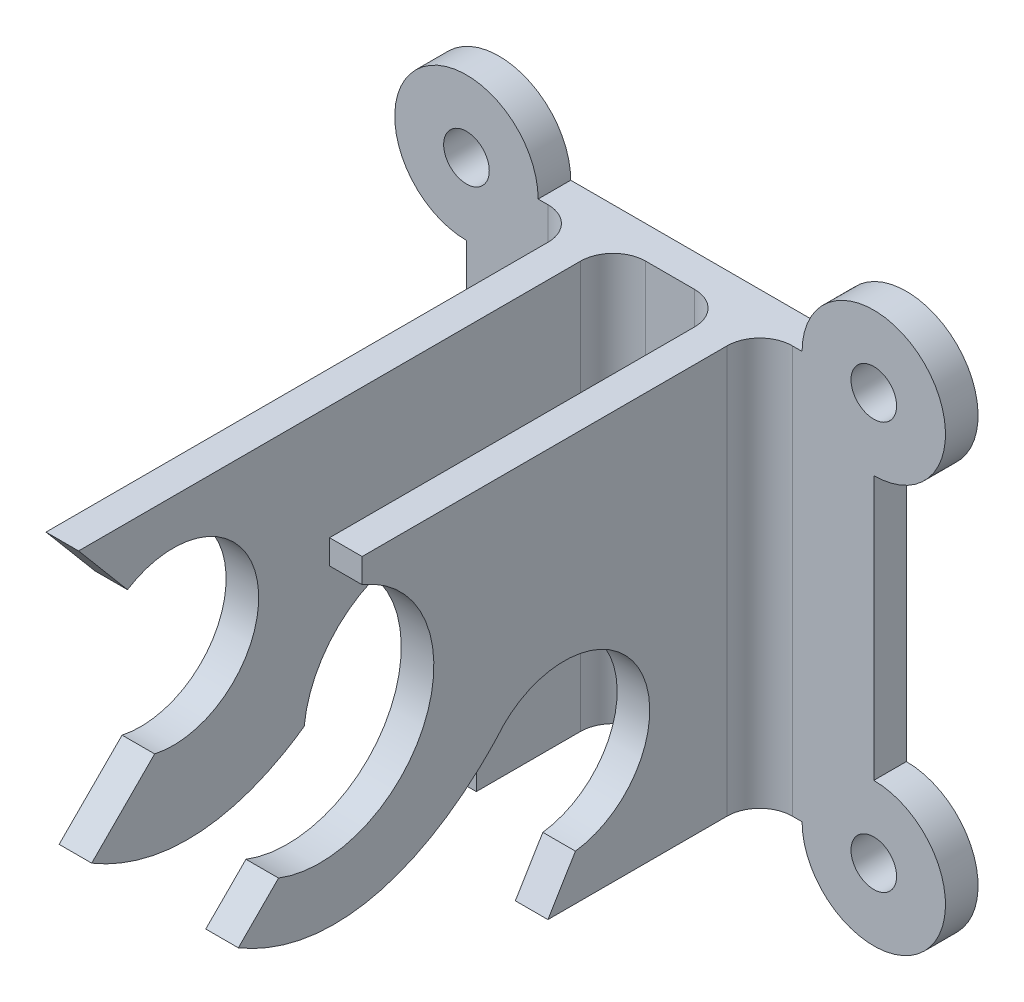
ISO-10303-21;
HEADER;
FILE_DESCRIPTION(('STEP AP214'),'2;1');
FILE_NAME('part.step','',(''),(''),'','','');
FILE_SCHEMA(('AUTOMOTIVE_DESIGN { 1 0 10303 214 1 1 1 1 }'));
ENDSEC;
DATA;
#1=APPLICATION_CONTEXT('core data for automotive mechanical design processes');
#2=APPLICATION_PROTOCOL_DEFINITION('international standard','automotive_design',2000,#1);
#3=PRODUCT_CONTEXT('',#1,'mechanical');
#4=PRODUCT('Part','Part','',(#3));
#5=PRODUCT_RELATED_PRODUCT_CATEGORY('part','',(#4));
#6=PRODUCT_DEFINITION_FORMATION('','',#4);
#7=PRODUCT_DEFINITION_CONTEXT('part definition',#1,'design');
#8=PRODUCT_DEFINITION('design','',#6,#7);
#9=PRODUCT_DEFINITION_SHAPE('','',#8);
#10=(LENGTH_UNIT() NAMED_UNIT(*) SI_UNIT(.MILLI.,.METRE.));
#11=(NAMED_UNIT(*) PLANE_ANGLE_UNIT() SI_UNIT($,.RADIAN.));
#12=(NAMED_UNIT(*) SI_UNIT($,.STERADIAN.) SOLID_ANGLE_UNIT());
#13=UNCERTAINTY_MEASURE_WITH_UNIT(LENGTH_MEASURE(1.E-05),#10,'distance_accuracy_value','');
#14=(GEOMETRIC_REPRESENTATION_CONTEXT(3) GLOBAL_UNCERTAINTY_ASSIGNED_CONTEXT((#13)) GLOBAL_UNIT_ASSIGNED_CONTEXT((#10,
#11,#12)) REPRESENTATION_CONTEXT('',''));
#15=CARTESIAN_POINT('',(0.,0.,0.));
#16=DIRECTION('',(0.,0.,1.));
#17=DIRECTION('',(1.,0.,0.));
#18=AXIS2_PLACEMENT_3D('',#15,#16,#17);
#19=CARTESIAN_POINT('',(0.,0.,2.));
#20=DIRECTION('',(0.,0.,-1.));
#21=DIRECTION('',(-1.,0.,0.));
#22=AXIS2_PLACEMENT_3D('',#19,#20,#21);
#23=CYLINDRICAL_SURFACE('',#22,4.4);
#24=CARTESIAN_POINT('',(0.,0.,0.));
#25=DIRECTION('',(0.,0.,1.));
#26=DIRECTION('',(1.,0.,0.));
#27=AXIS2_PLACEMENT_3D('',#24,#25,#26);
#28=CIRCLE('',#27,4.4);
#29=CARTESIAN_POINT('',(0.,4.4,0.));
#30=VERTEX_POINT('',#29);
#31=CARTESIAN_POINT('',(4.4,0.,0.));
#32=VERTEX_POINT('',#31);
#33=EDGE_CURVE('E353',#30,#32,#28,.T.);
#34=ORIENTED_EDGE('',*,*,#33,.T.);
#35=DIRECTION('',(0.,0.,-1.));
#36=VECTOR('',#35,1.);
#37=CARTESIAN_POINT('',(4.4,0.,2.));
#38=LINE('',#37,#36);
#39=CARTESIAN_POINT('',(4.4,0.,2.));
#40=VERTEX_POINT('',#39);
#41=EDGE_CURVE('E396',#40,#32,#38,.T.);
#42=ORIENTED_EDGE('',*,*,#41,.F.);
#43=CARTESIAN_POINT('',(0.,0.,2.));
#44=DIRECTION('',(0.,0.,1.));
#45=DIRECTION('',(1.,0.,0.));
#46=AXIS2_PLACEMENT_3D('',#43,#44,#45);
#47=CIRCLE('',#46,4.4);
#48=CARTESIAN_POINT('',(0.,4.4,2.));
#49=VERTEX_POINT('',#48);
#50=EDGE_CURVE('E354',#49,#40,#47,.T.);
#51=ORIENTED_EDGE('',*,*,#50,.F.);
#52=DIRECTION('',(0.,0.,-1.));
#53=VECTOR('',#52,1.);
#54=CARTESIAN_POINT('',(0.,4.4,2.));
#55=LINE('',#54,#53);
#56=EDGE_CURVE('E373',#49,#30,#55,.T.);
#57=ORIENTED_EDGE('',*,*,#56,.T.);
#58=EDGE_LOOP('',(#34,#42,#51,#57));
#59=FACE_BOUND('',#58,.T.);
#60=ADVANCED_FACE('F35',(#59),#23,.T.);
#61=CARTESIAN_POINT('',(0.,0.,2.));
#62=DIRECTION('',(0.,1.,0.));
#63=DIRECTION('',(0.,0.,1.));
#64=AXIS2_PLACEMENT_3D('',#61,#62,#63);
#65=PLANE('',#64);
#66=DIRECTION('',(0.,0.,-1.));
#67=VECTOR('',#66,1.);
#68=CARTESIAN_POINT('',(9.,0.,40.));
#69=LINE('',#68,#67);
#70=CARTESIAN_POINT('',(9.00000000000001,0.,10.394448724536));
#71=VERTEX_POINT('',#70);
#72=CARTESIAN_POINT('',(9.,0.,4.));
#73=VERTEX_POINT('',#72);
#74=EDGE_CURVE('E342',#71,#73,#69,.T.);
#75=ORIENTED_EDGE('',*,*,#74,.F.);
#76=DIRECTION('',(-1.,0.,0.));
#77=VECTOR('',#76,1.);
#78=CARTESIAN_POINT('',(29.401,0.,10.394448724536));
#79=LINE('',#78,#77);
#80=CARTESIAN_POINT('',(7.,0.,10.394448724536));
#81=VERTEX_POINT('',#80);
#82=EDGE_CURVE('E465',#71,#81,#79,.T.);
#83=ORIENTED_EDGE('',*,*,#82,.T.);
#84=DIRECTION('',(0.,0.,-1.));
#85=VECTOR('',#84,1.);
#86=CARTESIAN_POINT('',(7.,0.,40.));
#87=LINE('',#86,#85);
#88=CARTESIAN_POINT('',(7.,0.,4.));
#89=VERTEX_POINT('',#88);
#90=EDGE_CURVE('E345',#81,#89,#87,.T.);
#91=ORIENTED_EDGE('',*,*,#90,.T.);
#92=CARTESIAN_POINT('',(5.,0.,4.));
#93=DIRECTION('',(0.,1.,0.));
#94=DIRECTION('',(0.,0.,1.));
#95=AXIS2_PLACEMENT_3D('',#92,#93,#94);
#96=CIRCLE('',#95,2.);
#97=CARTESIAN_POINT('',(5.,0.,2.));
#98=VERTEX_POINT('',#97);
#99=EDGE_CURVE('E43',#89,#98,#96,.T.);
#100=ORIENTED_EDGE('',*,*,#99,.T.);
#101=DIRECTION('',(1.,0.,0.));
#102=VECTOR('',#101,1.);
#103=CARTESIAN_POINT('',(0.,0.,2.));
#104=LINE('',#103,#102);
#105=EDGE_CURVE('E357',#40,#98,#104,.T.);
#106=ORIENTED_EDGE('',*,*,#105,.F.);
#107=ORIENTED_EDGE('',*,*,#41,.T.);
#108=DIRECTION('',(1.,0.,0.));
#109=VECTOR('',#108,1.);
#110=CARTESIAN_POINT('',(0.,0.,0.));
#111=LINE('',#110,#109);
#112=CARTESIAN_POINT('',(20.6,0.,0.));
#113=VERTEX_POINT('',#112);
#114=EDGE_CURVE('E376',#32,#113,#111,.T.);
#115=ORIENTED_EDGE('',*,*,#114,.T.);
#116=DIRECTION('',(0.,0.,-1.));
#117=VECTOR('',#116,1.);
#118=CARTESIAN_POINT('',(20.6,0.,2.));
#119=LINE('',#118,#117);
#120=CARTESIAN_POINT('',(20.6,0.,2.));
#121=VERTEX_POINT('',#120);
#122=EDGE_CURVE('E303',#121,#113,#119,.T.);
#123=ORIENTED_EDGE('',*,*,#122,.F.);
#124=DIRECTION('',(1.,0.,0.));
#125=VECTOR('',#124,1.);
#126=CARTESIAN_POINT('',(0.,0.,2.));
#127=LINE('',#126,#125);
#128=CARTESIAN_POINT('',(20.,0.,2.));
#129=VERTEX_POINT('',#128);
#130=EDGE_CURVE('E295',#129,#121,#127,.T.);
#131=ORIENTED_EDGE('',*,*,#130,.F.);
#132=CARTESIAN_POINT('',(20.,0.,4.));
#133=DIRECTION('',(0.,1.,0.));
#134=DIRECTION('',(0.,0.,1.));
#135=AXIS2_PLACEMENT_3D('',#132,#133,#134);
#136=CIRCLE('',#135,2.);
#137=CARTESIAN_POINT('',(18.,0.,4.));
#138=VERTEX_POINT('',#137);
#139=EDGE_CURVE('E425',#129,#138,#136,.T.);
#140=ORIENTED_EDGE('',*,*,#139,.T.);
#141=DIRECTION('',(0.,0.,-1.));
#142=VECTOR('',#141,1.);
#143=CARTESIAN_POINT('',(18.,0.,40.));
#144=LINE('',#143,#142);
#145=CARTESIAN_POINT('',(18.,0.,15.));
#146=VERTEX_POINT('',#145);
#147=EDGE_CURVE('E328',#146,#138,#144,.T.);
#148=ORIENTED_EDGE('',*,*,#147,.F.);
#149=DIRECTION('',(-1.,0.,0.));
#150=VECTOR('',#149,1.);
#151=CARTESIAN_POINT('',(29.4,0.,15.));
#152=LINE('',#151,#150);
#153=CARTESIAN_POINT('',(16.,0.,15.));
#154=VERTEX_POINT('',#153);
#155=EDGE_CURVE('E614',#146,#154,#152,.T.);
#156=ORIENTED_EDGE('',*,*,#155,.T.);
#157=DIRECTION('',(0.,0.,-1.));
#158=VECTOR('',#157,1.);
#159=CARTESIAN_POINT('',(16.,0.,40.));
#160=LINE('',#159,#158);
#161=CARTESIAN_POINT('',(16.,0.,4.));
#162=VERTEX_POINT('',#161);
#163=EDGE_CURVE('E330',#154,#162,#160,.T.);
#164=ORIENTED_EDGE('',*,*,#163,.T.);
#165=CARTESIAN_POINT('',(14.,0.,4.));
#166=DIRECTION('',(0.,1.,0.));
#167=DIRECTION('',(0.,0.,1.));
#168=AXIS2_PLACEMENT_3D('',#165,#166,#167);
#169=CIRCLE('',#168,2.);
#170=CARTESIAN_POINT('',(14.,0.,2.));
#171=VERTEX_POINT('',#170);
#172=EDGE_CURVE('E429',#162,#171,#169,.T.);
#173=ORIENTED_EDGE('',*,*,#172,.T.);
#174=DIRECTION('',(1.,0.,0.));
#175=VECTOR('',#174,1.);
#176=CARTESIAN_POINT('',(0.,0.,2.));
#177=LINE('',#176,#175);
#178=CARTESIAN_POINT('',(11.,0.,2.));
#179=VERTEX_POINT('',#178);
#180=EDGE_CURVE('E336',#179,#171,#177,.T.);
#181=ORIENTED_EDGE('',*,*,#180,.F.);
#182=CARTESIAN_POINT('',(11.,0.,4.));
#183=DIRECTION('',(0.,1.,0.));
#184=DIRECTION('',(0.,0.,1.));
#185=AXIS2_PLACEMENT_3D('',#182,#183,#184);
#186=CIRCLE('',#185,2.);
#187=EDGE_CURVE('E433',#179,#73,#186,.T.);
#188=ORIENTED_EDGE('',*,*,#187,.T.);
#189=EDGE_LOOP('',(#75,#83,#91,#100,#106,#107,#115,#123,#131,#140,#148,#156,#164,#173,#181,#188));
#190=FACE_BOUND('',#189,.T.);
#191=ADVANCED_FACE('F452',(#190),#65,.F.);
#192=CARTESIAN_POINT('',(0.,25.,2.));
#193=DIRECTION('',(0.,1.,0.));
#194=DIRECTION('',(0.,0.,1.));
#195=AXIS2_PLACEMENT_3D('',#192,#193,#194);
#196=PLANE('',#195);
#197=DIRECTION('',(1.,0.,0.));
#198=VECTOR('',#197,1.);
#199=CARTESIAN_POINT('',(-4.40100000000001,25.,26.4019237886466));
#200=LINE('',#199,#198);
#201=CARTESIAN_POINT('',(16.,25.,26.4019237886466));
#202=VERTEX_POINT('',#201);
#203=CARTESIAN_POINT('',(18.,25.,26.4019237886466));
#204=VERTEX_POINT('',#203);
#205=EDGE_CURVE('E250',#202,#204,#200,.T.);
#206=ORIENTED_EDGE('',*,*,#205,.T.);
#207=DIRECTION('',(0.,0.,-1.));
#208=VECTOR('',#207,1.);
#209=CARTESIAN_POINT('',(18.,25.,40.));
#210=LINE('',#209,#208);
#211=CARTESIAN_POINT('',(18.,25.,4.));
#212=VERTEX_POINT('',#211);
#213=EDGE_CURVE('E249',#204,#212,#210,.T.);
#214=ORIENTED_EDGE('',*,*,#213,.T.);
#215=CARTESIAN_POINT('',(20.,25.,4.));
#216=DIRECTION('',(0.,1.,0.));
#217=DIRECTION('',(0.,0.,1.));
#218=AXIS2_PLACEMENT_3D('',#215,#216,#217);
#219=CIRCLE('',#218,2.);
#220=CARTESIAN_POINT('',(20.,25.,2.));
#221=VERTEX_POINT('',#220);
#222=EDGE_CURVE('E427',#212,#221,#219,.F.);
#223=ORIENTED_EDGE('',*,*,#222,.T.);
#224=DIRECTION('',(1.,0.,0.));
#225=VECTOR('',#224,1.);
#226=CARTESIAN_POINT('',(0.,25.,2.));
#227=LINE('',#226,#225);
#228=CARTESIAN_POINT('',(20.6,25.,2.));
#229=VERTEX_POINT('',#228);
#230=EDGE_CURVE('E293',#221,#229,#227,.T.);
#231=ORIENTED_EDGE('',*,*,#230,.T.);
#232=DIRECTION('',(0.,0.,-1.));
#233=VECTOR('',#232,1.);
#234=CARTESIAN_POINT('',(20.6,25.,2.));
#235=LINE('',#234,#233);
#236=CARTESIAN_POINT('',(20.6,25.,0.));
#237=VERTEX_POINT('',#236);
#238=EDGE_CURVE('E318',#229,#237,#235,.T.);
#239=ORIENTED_EDGE('',*,*,#238,.T.);
#240=DIRECTION('',(1.,0.,0.));
#241=VECTOR('',#240,1.);
#242=CARTESIAN_POINT('',(0.,25.,0.));
#243=LINE('',#242,#241);
#244=CARTESIAN_POINT('',(4.39999999999999,25.,0.));
#245=VERTEX_POINT('',#244);
#246=EDGE_CURVE('E378',#245,#237,#243,.T.);
#247=ORIENTED_EDGE('',*,*,#246,.F.);
#248=DIRECTION('',(0.,0.,-1.));
#249=VECTOR('',#248,1.);
#250=CARTESIAN_POINT('',(4.39999999999999,25.,2.));
#251=LINE('',#250,#249);
#252=CARTESIAN_POINT('',(4.39999999999999,25.,2.));
#253=VERTEX_POINT('',#252);
#254=EDGE_CURVE('E394',#253,#245,#251,.T.);
#255=ORIENTED_EDGE('',*,*,#254,.F.);
#256=DIRECTION('',(1.,0.,0.));
#257=VECTOR('',#256,1.);
#258=CARTESIAN_POINT('',(0.,25.,2.));
#259=LINE('',#258,#257);
#260=CARTESIAN_POINT('',(5.,25.,2.));
#261=VERTEX_POINT('',#260);
#262=EDGE_CURVE('E360',#253,#261,#259,.T.);
#263=ORIENTED_EDGE('',*,*,#262,.T.);
#264=CARTESIAN_POINT('',(5.,25.,4.));
#265=DIRECTION('',(0.,1.,0.));
#266=DIRECTION('',(0.,0.,1.));
#267=AXIS2_PLACEMENT_3D('',#264,#265,#266);
#268=CIRCLE('',#267,2.);
#269=CARTESIAN_POINT('',(7.,25.,4.));
#270=VERTEX_POINT('',#269);
#271=EDGE_CURVE('E11',#261,#270,#268,.F.);
#272=ORIENTED_EDGE('',*,*,#271,.T.);
#273=DIRECTION('',(0.,0.,-1.));
#274=VECTOR('',#273,1.);
#275=CARTESIAN_POINT('',(7.,25.,40.));
#276=LINE('',#275,#274);
#277=CARTESIAN_POINT('',(7.,25.,34.8048114115569));
#278=VERTEX_POINT('',#277);
#279=EDGE_CURVE('E347',#278,#270,#276,.T.);
#280=ORIENTED_EDGE('',*,*,#279,.F.);
#281=DIRECTION('',(-1.,0.,0.));
#282=VECTOR('',#281,1.);
#283=CARTESIAN_POINT('',(29.4,25.,34.8048114115569));
#284=LINE('',#283,#282);
#285=CARTESIAN_POINT('',(9.,25.,34.8048114115569));
#286=VERTEX_POINT('',#285);
#287=EDGE_CURVE('E612',#286,#278,#284,.T.);
#288=ORIENTED_EDGE('',*,*,#287,.F.);
#289=DIRECTION('',(0.,0.,-1.));
#290=VECTOR('',#289,1.);
#291=CARTESIAN_POINT('',(9.,25.,40.));
#292=LINE('',#291,#290);
#293=CARTESIAN_POINT('',(9.,25.,4.));
#294=VERTEX_POINT('',#293);
#295=EDGE_CURVE('E350',#286,#294,#292,.T.);
#296=ORIENTED_EDGE('',*,*,#295,.T.);
#297=CARTESIAN_POINT('',(11.,25.,4.));
#298=DIRECTION('',(0.,1.,0.));
#299=DIRECTION('',(0.,0.,1.));
#300=AXIS2_PLACEMENT_3D('',#297,#298,#299);
#301=CIRCLE('',#300,2.);
#302=CARTESIAN_POINT('',(11.,25.,2.));
#303=VERTEX_POINT('',#302);
#304=EDGE_CURVE('E435',#294,#303,#301,.F.);
#305=ORIENTED_EDGE('',*,*,#304,.T.);
#306=DIRECTION('',(1.,0.,0.));
#307=VECTOR('',#306,1.);
#308=CARTESIAN_POINT('',(0.,25.,2.));
#309=LINE('',#308,#307);
#310=CARTESIAN_POINT('',(14.,25.,2.));
#311=VERTEX_POINT('',#310);
#312=EDGE_CURVE('E339',#303,#311,#309,.T.);
#313=ORIENTED_EDGE('',*,*,#312,.T.);
#314=CARTESIAN_POINT('',(14.,25.,4.));
#315=DIRECTION('',(0.,1.,0.));
#316=DIRECTION('',(0.,0.,1.));
#317=AXIS2_PLACEMENT_3D('',#314,#315,#316);
#318=CIRCLE('',#317,2.);
#319=CARTESIAN_POINT('',(16.,25.,4.));
#320=VERTEX_POINT('',#319);
#321=EDGE_CURVE('E431',#311,#320,#318,.F.);
#322=ORIENTED_EDGE('',*,*,#321,.T.);
#323=DIRECTION('',(0.,0.,-1.));
#324=VECTOR('',#323,1.);
#325=CARTESIAN_POINT('',(16.,25.,40.));
#326=LINE('',#325,#324);
#327=EDGE_CURVE('E333',#202,#320,#326,.T.);
#328=ORIENTED_EDGE('',*,*,#327,.F.);
#329=EDGE_LOOP('',(#206,#214,#223,#231,#239,#247,#255,#263,#272,#280,#288,#296,#305,#313,#322,#328));
#330=FACE_BOUND('',#329,.T.);
#331=ADVANCED_FACE('F439',(#330),#196,.T.);
#332=CARTESIAN_POINT('',(0.,25.,2.));
#333=DIRECTION('',(0.,0.,-1.));
#334=DIRECTION('',(-1.,0.,0.));
#335=AXIS2_PLACEMENT_3D('',#332,#333,#334);
#336=CYLINDRICAL_SURFACE('',#335,4.4);
#337=CARTESIAN_POINT('',(0.,25.,0.));
#338=DIRECTION('',(0.,0.,1.));
#339=DIRECTION('',(1.,0.,0.));
#340=AXIS2_PLACEMENT_3D('',#337,#338,#339);
#341=CIRCLE('',#340,4.4);
#342=CARTESIAN_POINT('',(0.,20.6,0.));
#343=VERTEX_POINT('',#342);
#344=EDGE_CURVE('E380',#245,#343,#341,.T.);
#345=ORIENTED_EDGE('',*,*,#344,.T.);
#346=DIRECTION('',(0.,0.,-1.));
#347=VECTOR('',#346,1.);
#348=CARTESIAN_POINT('',(0.,20.6,2.));
#349=LINE('',#348,#347);
#350=CARTESIAN_POINT('',(0.,20.6,2.));
#351=VERTEX_POINT('',#350);
#352=EDGE_CURVE('E392',#351,#343,#349,.T.);
#353=ORIENTED_EDGE('',*,*,#352,.F.);
#354=CARTESIAN_POINT('',(0.,25.,2.));
#355=DIRECTION('',(0.,0.,1.));
#356=DIRECTION('',(1.,0.,0.));
#357=AXIS2_PLACEMENT_3D('',#354,#355,#356);
#358=CIRCLE('',#357,4.4);
#359=EDGE_CURVE('E362',#253,#351,#358,.T.);
#360=ORIENTED_EDGE('',*,*,#359,.F.);
#361=ORIENTED_EDGE('',*,*,#254,.T.);
#362=EDGE_LOOP('',(#345,#353,#360,#361));
#363=FACE_BOUND('',#362,.T.);
#364=ADVANCED_FACE('F562',(#363),#336,.T.);
#365=CARTESIAN_POINT('',(0.,0.,2.));
#366=DIRECTION('',(0.,0.,-1.));
#367=DIRECTION('',(-1.,0.,0.));
#368=AXIS2_PLACEMENT_3D('',#365,#366,#367);
#369=CYLINDRICAL_SURFACE('',#368,1.4);
#370=CARTESIAN_POINT('',(0.,0.,2.));
#371=DIRECTION('',(0.,0.,1.));
#372=DIRECTION('',(1.,0.,0.));
#373=AXIS2_PLACEMENT_3D('',#370,#371,#372);
#374=CIRCLE('',#373,1.4);
#375=CARTESIAN_POINT('',(1.4,0.,2.));
#376=VERTEX_POINT('',#375);
#377=EDGE_CURVE('E367',#376,#376,#374,.T.);
#378=ORIENTED_EDGE('',*,*,#377,.T.);
#379=EDGE_LOOP('',(#378));
#380=FACE_BOUND('',#379,.T.);
#381=CARTESIAN_POINT('',(0.,0.,0.));
#382=DIRECTION('',(0.,0.,1.));
#383=DIRECTION('',(1.,0.,0.));
#384=AXIS2_PLACEMENT_3D('',#381,#382,#383);
#385=CIRCLE('',#384,1.4);
#386=CARTESIAN_POINT('',(1.4,0.,0.));
#387=VERTEX_POINT('',#386);
#388=EDGE_CURVE('E386',#387,#387,#385,.T.);
#389=ORIENTED_EDGE('',*,*,#388,.F.);
#390=EDGE_LOOP('',(#389));
#391=FACE_BOUND('',#390,.T.);
#392=ADVANCED_FACE('F559',(#380,#391),#369,.F.);
#393=CARTESIAN_POINT('',(0.,0.,2.));
#394=DIRECTION('',(-1.,0.,0.));
#395=DIRECTION('',(0.,-1.,0.));
#396=AXIS2_PLACEMENT_3D('',#393,#394,#395);
#397=PLANE('',#396);
#398=DIRECTION('',(0.,1.,0.));
#399=VECTOR('',#398,1.);
#400=CARTESIAN_POINT('',(0.,0.,0.));
#401=LINE('',#400,#399);
#402=EDGE_CURVE('E383',#30,#343,#401,.T.);
#403=ORIENTED_EDGE('',*,*,#402,.F.);
#404=ORIENTED_EDGE('',*,*,#56,.F.);
#405=DIRECTION('',(0.,1.,0.));
#406=VECTOR('',#405,1.);
#407=CARTESIAN_POINT('',(0.,0.,2.));
#408=LINE('',#407,#406);
#409=EDGE_CURVE('E364',#49,#351,#408,.T.);
#410=ORIENTED_EDGE('',*,*,#409,.T.);
#411=ORIENTED_EDGE('',*,*,#352,.T.);
#412=EDGE_LOOP('',(#403,#404,#410,#411));
#413=FACE_BOUND('',#412,.T.);
#414=ADVANCED_FACE('F557',(#413),#397,.T.);
#415=CARTESIAN_POINT('',(0.,25.,2.));
#416=DIRECTION('',(0.,0.,-1.));
#417=DIRECTION('',(-1.,0.,0.));
#418=AXIS2_PLACEMENT_3D('',#415,#416,#417);
#419=CYLINDRICAL_SURFACE('',#418,1.4);
#420=CARTESIAN_POINT('',(0.,25.,2.));
#421=DIRECTION('',(0.,0.,1.));
#422=DIRECTION('',(1.,0.,0.));
#423=AXIS2_PLACEMENT_3D('',#420,#421,#422);
#424=CIRCLE('',#423,1.4);
#425=CARTESIAN_POINT('',(1.39999999999999,25.,2.));
#426=VERTEX_POINT('',#425);
#427=EDGE_CURVE('E370',#426,#426,#424,.T.);
#428=ORIENTED_EDGE('',*,*,#427,.T.);
#429=EDGE_LOOP('',(#428));
#430=FACE_BOUND('',#429,.T.);
#431=CARTESIAN_POINT('',(0.,25.,0.));
#432=DIRECTION('',(0.,0.,1.));
#433=DIRECTION('',(1.,0.,0.));
#434=AXIS2_PLACEMENT_3D('',#431,#432,#433);
#435=CIRCLE('',#434,1.4);
#436=CARTESIAN_POINT('',(1.39999999999999,25.,0.));
#437=VERTEX_POINT('',#436);
#438=EDGE_CURVE('E358',#437,#437,#435,.T.);
#439=ORIENTED_EDGE('',*,*,#438,.F.);
#440=EDGE_LOOP('',(#439));
#441=FACE_BOUND('',#440,.T.);
#442=ADVANCED_FACE('F551',(#430,#441),#419,.F.);
#443=CARTESIAN_POINT('',(0.,0.,2.));
#444=DIRECTION('',(0.,0.,1.));
#445=DIRECTION('',(1.,0.,0.));
#446=AXIS2_PLACEMENT_3D('',#443,#444,#445);
#447=PLANE('',#446);
#448=ORIENTED_EDGE('',*,*,#105,.T.);
#449=DIRECTION('',(0.,-1.,0.));
#450=VECTOR('',#449,1.);
#451=CARTESIAN_POINT('',(5.,0.,2.));
#452=LINE('',#451,#450);
#453=EDGE_CURVE('E50',#98,#261,#452,.F.);
#454=ORIENTED_EDGE('',*,*,#453,.T.);
#455=ORIENTED_EDGE('',*,*,#262,.F.);
#456=ORIENTED_EDGE('',*,*,#359,.T.);
#457=ORIENTED_EDGE('',*,*,#409,.F.);
#458=ORIENTED_EDGE('',*,*,#50,.T.);
#459=EDGE_LOOP('',(#448,#454,#455,#456,#457,#458));
#460=FACE_BOUND('',#459,.T.);
#461=ORIENTED_EDGE('',*,*,#377,.F.);
#462=EDGE_LOOP('',(#461));
#463=FACE_BOUND('',#462,.T.);
#464=ORIENTED_EDGE('',*,*,#427,.F.);
#465=EDGE_LOOP('',(#464));
#466=FACE_BOUND('',#465,.T.);
#467=ADVANCED_FACE('F548',(#460,#463,#466),#447,.T.);
#468=CARTESIAN_POINT('',(0.,0.,0.));
#469=DIRECTION('',(0.,0.,1.));
#470=DIRECTION('',(1.,0.,0.));
#471=AXIS2_PLACEMENT_3D('',#468,#469,#470);
#472=PLANE('',#471);
#473=ORIENTED_EDGE('',*,*,#33,.F.);
#474=ORIENTED_EDGE('',*,*,#402,.T.);
#475=ORIENTED_EDGE('',*,*,#344,.F.);
#476=ORIENTED_EDGE('',*,*,#246,.T.);
#477=CARTESIAN_POINT('',(25.,25.,0.));
#478=DIRECTION('',(0.,0.,1.));
#479=DIRECTION('',(1.,0.,0.));
#480=AXIS2_PLACEMENT_3D('',#477,#478,#479);
#481=CIRCLE('',#480,4.4);
#482=CARTESIAN_POINT('',(25.,20.6,0.));
#483=VERTEX_POINT('',#482);
#484=EDGE_CURVE('E308',#483,#237,#481,.T.);
#485=ORIENTED_EDGE('',*,*,#484,.F.);
#486=DIRECTION('',(0.,1.,0.));
#487=VECTOR('',#486,1.);
#488=CARTESIAN_POINT('',(25.,0.,0.));
#489=LINE('',#488,#487);
#490=CARTESIAN_POINT('',(25.,4.4,0.));
#491=VERTEX_POINT('',#490);
#492=EDGE_CURVE('E306',#491,#483,#489,.T.);
#493=ORIENTED_EDGE('',*,*,#492,.F.);
#494=CARTESIAN_POINT('',(25.,0.,0.));
#495=DIRECTION('',(0.,0.,1.));
#496=DIRECTION('',(1.,0.,0.));
#497=AXIS2_PLACEMENT_3D('',#494,#495,#496);
#498=CIRCLE('',#497,4.4);
#499=EDGE_CURVE('E283',#113,#491,#498,.T.);
#500=ORIENTED_EDGE('',*,*,#499,.F.);
#501=ORIENTED_EDGE('',*,*,#114,.F.);
#502=EDGE_LOOP('',(#473,#474,#475,#476,#485,#493,#500,#501));
#503=FACE_BOUND('',#502,.T.);
#504=ORIENTED_EDGE('',*,*,#388,.T.);
#505=EDGE_LOOP('',(#504));
#506=FACE_BOUND('',#505,.T.);
#507=ORIENTED_EDGE('',*,*,#438,.T.);
#508=EDGE_LOOP('',(#507));
#509=FACE_BOUND('',#508,.T.);
#510=CARTESIAN_POINT('',(25.,25.,0.));
#511=DIRECTION('',(0.,0.,1.));
#512=DIRECTION('',(1.,0.,0.));
#513=AXIS2_PLACEMENT_3D('',#510,#511,#512);
#514=CIRCLE('',#513,1.4);
#515=CARTESIAN_POINT('',(26.4,25.,0.));
#516=VERTEX_POINT('',#515);
#517=EDGE_CURVE('E311',#516,#516,#514,.T.);
#518=ORIENTED_EDGE('',*,*,#517,.T.);
#519=EDGE_LOOP('',(#518));
#520=FACE_BOUND('',#519,.T.);
#521=CARTESIAN_POINT('',(25.,0.,0.));
#522=DIRECTION('',(0.,0.,1.));
#523=DIRECTION('',(1.,0.,0.));
#524=AXIS2_PLACEMENT_3D('',#521,#522,#523);
#525=CIRCLE('',#524,1.4);
#526=CARTESIAN_POINT('',(26.4,0.,0.));
#527=VERTEX_POINT('',#526);
#528=EDGE_CURVE('E288',#527,#527,#525,.T.);
#529=ORIENTED_EDGE('',*,*,#528,.T.);
#530=EDGE_LOOP('',(#529));
#531=FACE_BOUND('',#530,.T.);
#532=ADVANCED_FACE('F544',(#503,#506,#509,#520,#531),#472,.F.);
#533=CARTESIAN_POINT('',(7.,0.,40.));
#534=DIRECTION('',(1.,0.,0.));
#535=DIRECTION('',(0.,1.,0.));
#536=AXIS2_PLACEMENT_3D('',#533,#534,#535);
#537=PLANE('',#536);
#538=ORIENTED_EDGE('',*,*,#279,.T.);
#539=DIRECTION('',(0.,-1.,0.));
#540=VECTOR('',#539,1.);
#541=CARTESIAN_POINT('',(7.,0.,4.));
#542=LINE('',#541,#540);
#543=EDGE_CURVE('E421',#270,#89,#542,.T.);
#544=ORIENTED_EDGE('',*,*,#543,.T.);
#545=ORIENTED_EDGE('',*,*,#90,.F.);
#546=DIRECTION('',(0.,-1.,0.));
#547=VECTOR('',#546,1.);
#548=CARTESIAN_POINT('',(7.,0.,10.394448724536));
#549=LINE('',#548,#547);
#550=CARTESIAN_POINT('',(7.,2.,10.394448724536));
#551=VERTEX_POINT('',#550);
#552=EDGE_CURVE('E462',#551,#81,#549,.T.);
#553=ORIENTED_EDGE('',*,*,#552,.F.);
#554=CARTESIAN_POINT('',(7.,8.,14.));
#555=DIRECTION('',(-1.,0.,0.));
#556=DIRECTION('',(0.,-1.,0.));
#557=AXIS2_PLACEMENT_3D('',#554,#555,#556);
#558=CIRCLE('',#557,7.);
#559=CARTESIAN_POINT('',(7.,8.74881908135148,20.9598326117374));
#560=VERTEX_POINT('',#559);
#561=EDGE_CURVE('E274',#560,#551,#558,.T.);
#562=ORIENTED_EDGE('',*,*,#561,.F.);
#563=CARTESIAN_POINT('',(7.,8.,34.));
#564=CARTESIAN_POINT('',(7.,4.56811171234291,28.1917284502045));
#565=CARTESIAN_POINT('',(7.,6.72069296549272,22.3497903186675));
#566=CARTESIAN_POINT('',(7.,11.2094298829705,18.154763510273));
#567=B_SPLINE_CURVE_WITH_KNOTS('',3,(#563,#564,#565,#566),.UNSPECIFIED.,.F.,.F.,(4,4),(0.,1.),.UNSPECIFIED.);
#568=CARTESIAN_POINT('',(7.,8.,34.));
#569=VERTEX_POINT('',#568);
#570=EDGE_CURVE('E602',#569,#560,#567,.T.);
#571=ORIENTED_EDGE('',*,*,#570,.F.);
#572=DIRECTION('',(0.,-0.708012201356827,0.706200200176877));
#573=VECTOR('',#572,1.);
#574=CARTESIAN_POINT('',(7.,11.8742938375118,30.1356215636516));
#575=LINE('',#574,#573);
#576=CARTESIAN_POINT('',(7.,11.8742938375118,30.1356215636516));
#577=VERTEX_POINT('',#576);
#578=EDGE_CURVE('E471',#577,#569,#575,.T.);
#579=ORIENTED_EDGE('',*,*,#578,.F.);
#580=CARTESIAN_POINT('',(7.,17.,29.));
#581=DIRECTION('',(-1.,0.,0.));
#582=DIRECTION('',(0.,-1.,0.));
#583=AXIS2_PLACEMENT_3D('',#580,#581,#582);
#584=CIRCLE('',#583,5.25);
#585=CARTESIAN_POINT('',(7.,21.4379649554272,31.8048114115569));
#586=VERTEX_POINT('',#585);
#587=EDGE_CURVE('E280',#586,#577,#584,.T.);
#588=ORIENTED_EDGE('',*,*,#587,.F.);
#589=DIRECTION('',(0.,-0.764869772211041,-0.644184935835844));
#590=VECTOR('',#589,1.);
#591=CARTESIAN_POINT('',(7.,21.4379649554273,31.8048114115569));
#592=LINE('',#591,#590);
#593=EDGE_CURVE('E597',#278,#586,#592,.T.);
#594=ORIENTED_EDGE('',*,*,#593,.F.);
#595=EDGE_LOOP('',(#538,#544,#545,#553,#562,#571,#579,#588,#594));
#596=FACE_BOUND('',#595,.T.);
#597=ADVANCED_FACE('F541',(#596),#537,.F.);
#598=CARTESIAN_POINT('',(9.00000000000001,0.,40.));
#599=DIRECTION('',(1.,0.,0.));
#600=DIRECTION('',(0.,1.,0.));
#601=AXIS2_PLACEMENT_3D('',#598,#599,#600);
#602=PLANE('',#601);
#603=ORIENTED_EDGE('',*,*,#74,.T.);
#604=DIRECTION('',(0.,-1.,0.));
#605=VECTOR('',#604,1.);
#606=CARTESIAN_POINT('',(9.,25.,4.));
#607=LINE('',#606,#605);
#608=EDGE_CURVE('E419',#73,#294,#607,.F.);
#609=ORIENTED_EDGE('',*,*,#608,.T.);
#610=ORIENTED_EDGE('',*,*,#295,.F.);
#611=DIRECTION('',(0.,0.764869772211041,0.644184935835844));
#612=VECTOR('',#611,1.);
#613=CARTESIAN_POINT('',(9.,12.934116564562,24.6427411754804));
#614=LINE('',#613,#612);
#615=CARTESIAN_POINT('',(9.,21.4379649554273,31.8048114115569));
#616=VERTEX_POINT('',#615);
#617=EDGE_CURVE('E625',#616,#286,#614,.T.);
#618=ORIENTED_EDGE('',*,*,#617,.F.);
#619=CARTESIAN_POINT('',(9.,17.,29.));
#620=DIRECTION('',(1.,0.,0.));
#621=DIRECTION('',(0.,1.,0.));
#622=AXIS2_PLACEMENT_3D('',#619,#620,#621);
#623=CIRCLE('',#622,5.25);
#624=CARTESIAN_POINT('',(9.,11.8742938375118,30.1356215636516));
#625=VERTEX_POINT('',#624);
#626=EDGE_CURVE('E277',#616,#625,#623,.F.);
#627=ORIENTED_EDGE('',*,*,#626,.T.);
#628=DIRECTION('',(0.,0.708012201356827,-0.706200200176877));
#629=VECTOR('',#628,1.);
#630=CARTESIAN_POINT('',(9.00000000000001,0.989759631883716,40.9922992029861));
#631=LINE('',#630,#629);
#632=CARTESIAN_POINT('',(9.00000000000001,8.,34.));
#633=VERTEX_POINT('',#632);
#634=EDGE_CURVE('E623',#633,#625,#631,.T.);
#635=ORIENTED_EDGE('',*,*,#634,.F.);
#636=CARTESIAN_POINT('',(9.00000000000001,8.,34.));
#637=CARTESIAN_POINT('',(9.00000000000001,4.56811171234291,28.1917284502045));
#638=CARTESIAN_POINT('',(9.00000000000001,6.72069296549273,22.3497903186675));
#639=CARTESIAN_POINT('',(9.00000000000001,11.2094298829705,18.154763510273));
#640=B_SPLINE_CURVE_WITH_KNOTS('',3,(#636,#637,#638,#639),.UNSPECIFIED.,.F.,.F.,(4,4),(0.,1.),.UNSPECIFIED.);
#641=CARTESIAN_POINT('',(9.00000000000001,8.74881908135148,20.9598326117374));
#642=VERTEX_POINT('',#641);
#643=EDGE_CURVE('E630',#642,#633,#640,.F.);
#644=ORIENTED_EDGE('',*,*,#643,.F.);
#645=CARTESIAN_POINT('',(9.00000000000001,8.,14.));
#646=DIRECTION('',(1.,0.,0.));
#647=DIRECTION('',(0.,1.,0.));
#648=AXIS2_PLACEMENT_3D('',#645,#646,#647);
#649=CIRCLE('',#648,7.);
#650=CARTESIAN_POINT('',(9.00000000000001,2.,10.394448724536));
#651=VERTEX_POINT('',#650);
#652=EDGE_CURVE('E271',#642,#651,#649,.F.);
#653=ORIENTED_EDGE('',*,*,#652,.T.);
#654=DIRECTION('',(0.,-1.,0.));
#655=VECTOR('',#654,1.);
#656=CARTESIAN_POINT('',(9.00000000000001,0.,10.394448724536));
#657=LINE('',#656,#655);
#658=EDGE_CURVE('E457',#651,#71,#657,.T.);
#659=ORIENTED_EDGE('',*,*,#658,.T.);
#660=EDGE_LOOP('',(#603,#609,#610,#618,#627,#635,#644,#653,#659));
#661=FACE_BOUND('',#660,.T.);
#662=ADVANCED_FACE('F456',(#661),#602,.T.);
#663=CARTESIAN_POINT('',(0.,0.,2.));
#664=DIRECTION('',(0.,0.,1.));
#665=DIRECTION('',(1.,0.,0.));
#666=AXIS2_PLACEMENT_3D('',#663,#664,#665);
#667=PLANE('',#666);
#668=ORIENTED_EDGE('',*,*,#180,.T.);
#669=DIRECTION('',(0.,-1.,0.));
#670=VECTOR('',#669,1.);
#671=CARTESIAN_POINT('',(14.,0.,2.));
#672=LINE('',#671,#670);
#673=EDGE_CURVE('E417',#171,#311,#672,.F.);
#674=ORIENTED_EDGE('',*,*,#673,.T.);
#675=ORIENTED_EDGE('',*,*,#312,.F.);
#676=DIRECTION('',(0.,-1.,0.));
#677=VECTOR('',#676,1.);
#678=CARTESIAN_POINT('',(11.,0.,2.));
#679=LINE('',#678,#677);
#680=EDGE_CURVE('E414',#303,#179,#679,.T.);
#681=ORIENTED_EDGE('',*,*,#680,.T.);
#682=EDGE_LOOP('',(#668,#674,#675,#681));
#683=FACE_BOUND('',#682,.T.);
#684=ADVANCED_FACE('F447',(#683),#667,.T.);
#685=CARTESIAN_POINT('',(16.,0.,40.));
#686=DIRECTION('',(1.,0.,0.));
#687=DIRECTION('',(0.,0.,-1.));
#688=AXIS2_PLACEMENT_3D('',#685,#686,#687);
#689=PLANE('',#688);
#690=ORIENTED_EDGE('',*,*,#327,.T.);
#691=DIRECTION('',(0.,-1.,0.));
#692=VECTOR('',#691,1.);
#693=CARTESIAN_POINT('',(16.,0.,4.));
#694=LINE('',#693,#692);
#695=EDGE_CURVE('E411',#320,#162,#694,.T.);
#696=ORIENTED_EDGE('',*,*,#695,.T.);
#697=ORIENTED_EDGE('',*,*,#163,.F.);
#698=DIRECTION('',(0.,0.856031490641379,-0.516923676213712));
#699=VECTOR('',#698,1.);
#700=CARTESIAN_POINT('',(16.,-11.0625736274261,21.6802521757575));
#701=LINE('',#700,#699);
#702=CARTESIAN_POINT('',(16.,2.79526939658851,13.3120469885873));
#703=VERTEX_POINT('',#702);
#704=EDGE_CURVE('E257',#154,#703,#701,.T.);
#705=ORIENTED_EDGE('',*,*,#704,.T.);
#706=CARTESIAN_POINT('',(16.,8.,14.));
#707=DIRECTION('',(1.,0.,0.));
#708=DIRECTION('',(0.,0.,-1.));
#709=AXIS2_PLACEMENT_3D('',#706,#707,#708);
#710=CIRCLE('',#709,5.25);
#711=CARTESIAN_POINT('',(16.,11.2094298829705,18.154763510273));
#712=VERTEX_POINT('',#711);
#713=EDGE_CURVE('E268',#712,#703,#710,.F.);
#714=ORIENTED_EDGE('',*,*,#713,.F.);
#715=CARTESIAN_POINT('',(16.,8.,34.));
#716=CARTESIAN_POINT('',(16.,4.56811171234291,28.1917284502045));
#717=CARTESIAN_POINT('',(16.,6.72069296549273,22.3497903186675));
#718=CARTESIAN_POINT('',(16.,11.2094298829705,18.154763510273));
#719=B_SPLINE_CURVE_WITH_KNOTS('',3,(#715,#716,#717,#718),.UNSPECIFIED.,.F.,.F.,(4,4),(0.,1.),.UNSPECIFIED.);
#720=CARTESIAN_POINT('',(16.,8.,34.));
#721=VERTEX_POINT('',#720);
#722=EDGE_CURVE('E641',#712,#721,#719,.F.);
#723=ORIENTED_EDGE('',*,*,#722,.T.);
#724=DIRECTION('',(0.,0.708012201356827,-0.706200200176877));
#725=VECTOR('',#724,1.);
#726=CARTESIAN_POINT('',(16.,0.989759631883716,40.9922992029861));
#727=LINE('',#726,#725);
#728=CARTESIAN_POINT('',(16.,10.4740762074138,31.5322556453403));
#729=VERTEX_POINT('',#728);
#730=EDGE_CURVE('E620',#721,#729,#727,.T.);
#731=ORIENTED_EDGE('',*,*,#730,.T.);
#732=CARTESIAN_POINT('',(16.,17.,29.));
#733=DIRECTION('',(1.,0.,0.));
#734=DIRECTION('',(0.,0.,-1.));
#735=AXIS2_PLACEMENT_3D('',#732,#733,#734);
#736=CIRCLE('',#735,7.00000000000001);
#737=CARTESIAN_POINT('',(16.,23.5,26.4019237886466));
#738=VERTEX_POINT('',#737);
#739=EDGE_CURVE('E256',#738,#729,#736,.F.);
#740=ORIENTED_EDGE('',*,*,#739,.F.);
#741=DIRECTION('',(0.,-1.,0.));
#742=VECTOR('',#741,1.);
#743=CARTESIAN_POINT('',(16.,25.,26.4019237886466));
#744=LINE('',#743,#742);
#745=EDGE_CURVE('E236',#202,#738,#744,.T.);
#746=ORIENTED_EDGE('',*,*,#745,.F.);
#747=EDGE_LOOP('',(#690,#696,#697,#705,#714,#723,#731,#740,#746));
#748=FACE_BOUND('',#747,.T.);
#749=ADVANCED_FACE('F535',(#748),#689,.F.);
#750=CARTESIAN_POINT('',(18.,0.,40.));
#751=DIRECTION('',(1.,0.,0.));
#752=DIRECTION('',(0.,1.,0.));
#753=AXIS2_PLACEMENT_3D('',#750,#751,#752);
#754=PLANE('',#753);
#755=ORIENTED_EDGE('',*,*,#147,.T.);
#756=DIRECTION('',(0.,-1.,0.));
#757=VECTOR('',#756,1.);
#758=CARTESIAN_POINT('',(18.,25.,4.));
#759=LINE('',#758,#757);
#760=EDGE_CURVE('E409',#138,#212,#759,.F.);
#761=ORIENTED_EDGE('',*,*,#760,.T.);
#762=ORIENTED_EDGE('',*,*,#213,.F.);
#763=DIRECTION('',(0.,1.,0.));
#764=VECTOR('',#763,1.);
#765=CARTESIAN_POINT('',(18.,25.,26.4019237886466));
#766=LINE('',#765,#764);
#767=CARTESIAN_POINT('',(18.,23.5,26.4019237886466));
#768=VERTEX_POINT('',#767);
#769=EDGE_CURVE('E233',#768,#204,#766,.T.);
#770=ORIENTED_EDGE('',*,*,#769,.F.);
#771=CARTESIAN_POINT('',(18.,17.,29.));
#772=DIRECTION('',(1.,0.,0.));
#773=DIRECTION('',(0.,1.,0.));
#774=AXIS2_PLACEMENT_3D('',#771,#772,#773);
#775=CIRCLE('',#774,7.00000000000001);
#776=CARTESIAN_POINT('',(18.,10.4740762074138,31.5322556453403));
#777=VERTEX_POINT('',#776);
#778=EDGE_CURVE('E247',#777,#768,#775,.T.);
#779=ORIENTED_EDGE('',*,*,#778,.F.);
#780=DIRECTION('',(0.,0.708012201356827,-0.706200200176877));
#781=VECTOR('',#780,1.);
#782=CARTESIAN_POINT('',(18.,0.989759631883717,40.9922992029861));
#783=LINE('',#782,#781);
#784=CARTESIAN_POINT('',(18.,8.,34.));
#785=VERTEX_POINT('',#784);
#786=EDGE_CURVE('E611',#785,#777,#783,.T.);
#787=ORIENTED_EDGE('',*,*,#786,.F.);
#788=CARTESIAN_POINT('',(18.,8.,34.));
#789=CARTESIAN_POINT('',(18.,4.56811171234291,28.1917284502045));
#790=CARTESIAN_POINT('',(18.,6.72069296549273,22.3497903186675));
#791=CARTESIAN_POINT('',(18.,11.2094298829705,18.154763510273));
#792=B_SPLINE_CURVE_WITH_KNOTS('',3,(#788,#789,#790,#791),.UNSPECIFIED.,.F.,.F.,(4,4),(0.,1.),.UNSPECIFIED.);
#793=CARTESIAN_POINT('',(18.,11.2094298829705,18.154763510273));
#794=VERTEX_POINT('',#793);
#795=EDGE_CURVE('E634',#794,#785,#792,.F.);
#796=ORIENTED_EDGE('',*,*,#795,.F.);
#797=CARTESIAN_POINT('',(18.,8.,14.));
#798=DIRECTION('',(1.,0.,0.));
#799=DIRECTION('',(0.,1.,0.));
#800=AXIS2_PLACEMENT_3D('',#797,#798,#799);
#801=CIRCLE('',#800,5.25);
#802=CARTESIAN_POINT('',(18.,2.79526939658851,13.3120469885873));
#803=VERTEX_POINT('',#802);
#804=EDGE_CURVE('E259',#803,#794,#801,.T.);
#805=ORIENTED_EDGE('',*,*,#804,.F.);
#806=DIRECTION('',(0.,0.856031490641379,-0.516923676213712));
#807=VECTOR('',#806,1.);
#808=CARTESIAN_POINT('',(18.,-11.0625736274261,21.6802521757575));
#809=LINE('',#808,#807);
#810=EDGE_CURVE('E262',#146,#803,#809,.T.);
#811=ORIENTED_EDGE('',*,*,#810,.F.);
#812=EDGE_LOOP('',(#755,#761,#762,#770,#779,#787,#796,#805,#811));
#813=FACE_BOUND('',#812,.T.);
#814=ADVANCED_FACE('F245',(#813),#754,.T.);
#815=CARTESIAN_POINT('',(25.,0.,2.));
#816=DIRECTION('',(0.,0.,-1.));
#817=DIRECTION('',(-1.,0.,0.));
#818=AXIS2_PLACEMENT_3D('',#815,#816,#817);
#819=CYLINDRICAL_SURFACE('',#818,4.4);
#820=ORIENTED_EDGE('',*,*,#499,.T.);
#821=DIRECTION('',(0.,0.,-1.));
#822=VECTOR('',#821,1.);
#823=CARTESIAN_POINT('',(25.,4.4,2.));
#824=LINE('',#823,#822);
#825=CARTESIAN_POINT('',(25.,4.4,2.));
#826=VERTEX_POINT('',#825);
#827=EDGE_CURVE('E324',#826,#491,#824,.T.);
#828=ORIENTED_EDGE('',*,*,#827,.F.);
#829=CARTESIAN_POINT('',(25.,0.,2.));
#830=DIRECTION('',(0.,0.,1.));
#831=DIRECTION('',(1.,0.,0.));
#832=AXIS2_PLACEMENT_3D('',#829,#830,#831);
#833=CIRCLE('',#832,4.4);
#834=EDGE_CURVE('E284',#121,#826,#833,.T.);
#835=ORIENTED_EDGE('',*,*,#834,.F.);
#836=ORIENTED_EDGE('',*,*,#122,.T.);
#837=EDGE_LOOP('',(#820,#828,#835,#836));
#838=FACE_BOUND('',#837,.T.);
#839=ADVANCED_FACE('F528',(#838),#819,.T.);
#840=CARTESIAN_POINT('',(25.,0.,2.));
#841=DIRECTION('',(-1.,0.,0.));
#842=DIRECTION('',(0.,-1.,0.));
#843=AXIS2_PLACEMENT_3D('',#840,#841,#842);
#844=PLANE('',#843);
#845=ORIENTED_EDGE('',*,*,#492,.T.);
#846=DIRECTION('',(0.,0.,-1.));
#847=VECTOR('',#846,1.);
#848=CARTESIAN_POINT('',(25.,20.6,2.));
#849=LINE('',#848,#847);
#850=CARTESIAN_POINT('',(25.,20.6,2.));
#851=VERTEX_POINT('',#850);
#852=EDGE_CURVE('E321',#851,#483,#849,.T.);
#853=ORIENTED_EDGE('',*,*,#852,.F.);
#854=DIRECTION('',(0.,1.,0.));
#855=VECTOR('',#854,1.);
#856=CARTESIAN_POINT('',(25.,0.,2.));
#857=LINE('',#856,#855);
#858=EDGE_CURVE('E287',#826,#851,#857,.T.);
#859=ORIENTED_EDGE('',*,*,#858,.F.);
#860=ORIENTED_EDGE('',*,*,#827,.T.);
#861=EDGE_LOOP('',(#845,#853,#859,#860));
#862=FACE_BOUND('',#861,.T.);
#863=ADVANCED_FACE('F524',(#862),#844,.F.);
#864=CARTESIAN_POINT('',(25.,25.,2.));
#865=DIRECTION('',(0.,0.,-1.));
#866=DIRECTION('',(-1.,0.,0.));
#867=AXIS2_PLACEMENT_3D('',#864,#865,#866);
#868=CYLINDRICAL_SURFACE('',#867,4.4);
#869=ORIENTED_EDGE('',*,*,#484,.T.);
#870=ORIENTED_EDGE('',*,*,#238,.F.);
#871=CARTESIAN_POINT('',(25.,25.,2.));
#872=DIRECTION('',(0.,0.,1.));
#873=DIRECTION('',(1.,0.,0.));
#874=AXIS2_PLACEMENT_3D('',#871,#872,#873);
#875=CIRCLE('',#874,4.4);
#876=EDGE_CURVE('E290',#851,#229,#875,.T.);
#877=ORIENTED_EDGE('',*,*,#876,.F.);
#878=ORIENTED_EDGE('',*,*,#852,.T.);
#879=EDGE_LOOP('',(#869,#870,#877,#878));
#880=FACE_BOUND('',#879,.T.);
#881=ADVANCED_FACE('F520',(#880),#868,.T.);
#882=CARTESIAN_POINT('',(25.,25.,2.));
#883=DIRECTION('',(0.,0.,-1.));
#884=DIRECTION('',(-1.,0.,0.));
#885=AXIS2_PLACEMENT_3D('',#882,#883,#884);
#886=CYLINDRICAL_SURFACE('',#885,1.4);
#887=CARTESIAN_POINT('',(25.,25.,2.));
#888=DIRECTION('',(0.,0.,1.));
#889=DIRECTION('',(1.,0.,0.));
#890=AXIS2_PLACEMENT_3D('',#887,#888,#889);
#891=CIRCLE('',#890,1.4);
#892=CARTESIAN_POINT('',(26.4,25.,2.));
#893=VERTEX_POINT('',#892);
#894=EDGE_CURVE('E297',#893,#893,#891,.T.);
#895=ORIENTED_EDGE('',*,*,#894,.T.);
#896=EDGE_LOOP('',(#895));
#897=FACE_BOUND('',#896,.T.);
#898=ORIENTED_EDGE('',*,*,#517,.F.);
#899=EDGE_LOOP('',(#898));
#900=FACE_BOUND('',#899,.T.);
#901=ADVANCED_FACE('F516',(#897,#900),#886,.F.);
#902=CARTESIAN_POINT('',(25.,0.,2.));
#903=DIRECTION('',(0.,0.,-1.));
#904=DIRECTION('',(-1.,0.,0.));
#905=AXIS2_PLACEMENT_3D('',#902,#903,#904);
#906=CYLINDRICAL_SURFACE('',#905,1.4);
#907=CARTESIAN_POINT('',(25.,0.,2.));
#908=DIRECTION('',(0.,0.,1.));
#909=DIRECTION('',(1.,0.,0.));
#910=AXIS2_PLACEMENT_3D('',#907,#908,#909);
#911=CIRCLE('',#910,1.4);
#912=CARTESIAN_POINT('',(26.4,0.,2.));
#913=VERTEX_POINT('',#912);
#914=EDGE_CURVE('E300',#913,#913,#911,.T.);
#915=ORIENTED_EDGE('',*,*,#914,.T.);
#916=EDGE_LOOP('',(#915));
#917=FACE_BOUND('',#916,.T.);
#918=ORIENTED_EDGE('',*,*,#528,.F.);
#919=EDGE_LOOP('',(#918));
#920=FACE_BOUND('',#919,.T.);
#921=ADVANCED_FACE('F512',(#917,#920),#906,.F.);
#922=CARTESIAN_POINT('',(0.,0.,2.));
#923=DIRECTION('',(0.,0.,1.));
#924=DIRECTION('',(1.,0.,0.));
#925=AXIS2_PLACEMENT_3D('',#922,#923,#924);
#926=PLANE('',#925);
#927=ORIENTED_EDGE('',*,*,#230,.F.);
#928=DIRECTION('',(0.,-1.,0.));
#929=VECTOR('',#928,1.);
#930=CARTESIAN_POINT('',(20.,0.,2.));
#931=LINE('',#930,#929);
#932=EDGE_CURVE('E406',#221,#129,#931,.T.);
#933=ORIENTED_EDGE('',*,*,#932,.T.);
#934=ORIENTED_EDGE('',*,*,#130,.T.);
#935=ORIENTED_EDGE('',*,*,#834,.T.);
#936=ORIENTED_EDGE('',*,*,#858,.T.);
#937=ORIENTED_EDGE('',*,*,#876,.T.);
#938=EDGE_LOOP('',(#927,#933,#934,#935,#936,#937));
#939=FACE_BOUND('',#938,.T.);
#940=ORIENTED_EDGE('',*,*,#894,.F.);
#941=EDGE_LOOP('',(#940));
#942=FACE_BOUND('',#941,.T.);
#943=ORIENTED_EDGE('',*,*,#914,.F.);
#944=EDGE_LOOP('',(#943));
#945=FACE_BOUND('',#944,.T.);
#946=ADVANCED_FACE('F508',(#939,#942,#945),#926,.T.);
#947=CARTESIAN_POINT('',(29.401,17.,29.));
#948=DIRECTION('',(-1.,0.,0.));
#949=DIRECTION('',(0.,-1.,0.));
#950=AXIS2_PLACEMENT_3D('',#947,#948,#949);
#951=CYLINDRICAL_SURFACE('',#950,5.25);
#952=ORIENTED_EDGE('',*,*,#626,.F.);
#953=DIRECTION('',(-1.,0.,0.));
#954=VECTOR('',#953,1.);
#955=CARTESIAN_POINT('',(29.4,21.4379649554273,31.8048114115569));
#956=LINE('',#955,#954);
#957=EDGE_CURVE('E609',#616,#586,#956,.T.);
#958=ORIENTED_EDGE('',*,*,#957,.T.);
#959=ORIENTED_EDGE('',*,*,#587,.T.);
#960=DIRECTION('',(-1.,0.,0.));
#961=VECTOR('',#960,1.);
#962=CARTESIAN_POINT('',(29.4,11.8742938375118,30.1356215636516));
#963=LINE('',#962,#961);
#964=EDGE_CURVE('E601',#625,#577,#963,.T.);
#965=ORIENTED_EDGE('',*,*,#964,.F.);
#966=EDGE_LOOP('',(#952,#958,#959,#965));
#967=FACE_BOUND('',#966,.T.);
#968=ADVANCED_FACE('F504',(#967),#951,.F.);
#969=CARTESIAN_POINT('',(29.401,8.,14.));
#970=DIRECTION('',(-1.,0.,0.));
#971=DIRECTION('',(0.,-1.,0.));
#972=AXIS2_PLACEMENT_3D('',#969,#970,#971);
#973=CYLINDRICAL_SURFACE('',#972,7.);
#974=ORIENTED_EDGE('',*,*,#561,.T.);
#975=DIRECTION('',(-1.,0.,0.));
#976=VECTOR('',#975,1.);
#977=CARTESIAN_POINT('',(29.401,2.,10.394448724536));
#978=LINE('',#977,#976);
#979=EDGE_CURVE('E463',#651,#551,#978,.T.);
#980=ORIENTED_EDGE('',*,*,#979,.F.);
#981=ORIENTED_EDGE('',*,*,#652,.F.);
#982=DIRECTION('',(-1.,0.,0.));
#983=VECTOR('',#982,1.);
#984=CARTESIAN_POINT('',(29.4,8.74881908135149,20.9598326117374));
#985=LINE('',#984,#983);
#986=EDGE_CURVE('E627',#642,#560,#985,.T.);
#987=ORIENTED_EDGE('',*,*,#986,.T.);
#988=EDGE_LOOP('',(#974,#980,#981,#987));
#989=FACE_BOUND('',#988,.T.);
#990=ADVANCED_FACE('F500',(#989),#973,.F.);
#991=CARTESIAN_POINT('',(-4.40100000000001,8.,14.));
#992=DIRECTION('',(1.,0.,0.));
#993=DIRECTION('',(0.,1.,0.));
#994=AXIS2_PLACEMENT_3D('',#991,#992,#993);
#995=CYLINDRICAL_SURFACE('',#994,5.25);
#996=ORIENTED_EDGE('',*,*,#713,.T.);
#997=DIRECTION('',(1.,0.,0.));
#998=VECTOR('',#997,1.);
#999=CARTESIAN_POINT('',(-4.40100000000001,2.7952693965885,13.3120469885873));
#1000=LINE('',#999,#998);
#1001=EDGE_CURVE('E403',#703,#803,#1000,.T.);
#1002=ORIENTED_EDGE('',*,*,#1001,.T.);
#1003=ORIENTED_EDGE('',*,*,#804,.T.);
#1004=DIRECTION('',(-1.,0.,0.));
#1005=VECTOR('',#1004,1.);
#1006=CARTESIAN_POINT('',(29.4,11.2094298829705,18.154763510273));
#1007=LINE('',#1006,#1005);
#1008=EDGE_CURVE('E400',#794,#712,#1007,.T.);
#1009=ORIENTED_EDGE('',*,*,#1008,.T.);
#1010=EDGE_LOOP('',(#996,#1002,#1003,#1009));
#1011=FACE_BOUND('',#1010,.T.);
#1012=ADVANCED_FACE('F497',(#1011),#995,.F.);
#1013=CARTESIAN_POINT('',(-4.40100000000001,17.,29.));
#1014=DIRECTION('',(1.,0.,0.));
#1015=DIRECTION('',(0.,1.,0.));
#1016=AXIS2_PLACEMENT_3D('',#1013,#1014,#1015);
#1017=CYLINDRICAL_SURFACE('',#1016,7.00000000000001);
#1018=ORIENTED_EDGE('',*,*,#778,.T.);
#1019=DIRECTION('',(1.,0.,0.));
#1020=VECTOR('',#1019,1.);
#1021=CARTESIAN_POINT('',(17.,23.5,26.4019237886466));
#1022=LINE('',#1021,#1020);
#1023=EDGE_CURVE('E230',#738,#768,#1022,.T.);
#1024=ORIENTED_EDGE('',*,*,#1023,.F.);
#1025=ORIENTED_EDGE('',*,*,#739,.T.);
#1026=DIRECTION('',(1.,0.,0.));
#1027=VECTOR('',#1026,1.);
#1028=CARTESIAN_POINT('',(-4.40100000000001,10.4740762074138,31.5322556453403));
#1029=LINE('',#1028,#1027);
#1030=EDGE_CURVE('E255',#729,#777,#1029,.T.);
#1031=ORIENTED_EDGE('',*,*,#1030,.T.);
#1032=EDGE_LOOP('',(#1018,#1024,#1025,#1031));
#1033=FACE_BOUND('',#1032,.T.);
#1034=ADVANCED_FACE('F253',(#1033),#1017,.F.);
#1035=CARTESIAN_POINT('',(29.4,11.8742938375118,30.1356215636516));
#1036=DIRECTION('',(0.,-0.706200200176877,-0.708012201356827));
#1037=DIRECTION('',(0.,0.708012201356827,-0.706200200176877));
#1038=AXIS2_PLACEMENT_3D('',#1035,#1036,#1037);
#1039=PLANE('',#1038);
#1040=DIRECTION('',(-1.,0.,0.));
#1041=VECTOR('',#1040,1.);
#1042=CARTESIAN_POINT('',(29.4,8.00000000000001,34.));
#1043=LINE('',#1042,#1041);
#1044=EDGE_CURVE('E617',#785,#721,#1043,.T.);
#1045=ORIENTED_EDGE('',*,*,#1044,.F.);
#1046=ORIENTED_EDGE('',*,*,#786,.T.);
#1047=ORIENTED_EDGE('',*,*,#1030,.F.);
#1048=ORIENTED_EDGE('',*,*,#730,.F.);
#1049=EDGE_LOOP('',(#1045,#1046,#1047,#1048));
#1050=FACE_BOUND('',#1049,.T.);
#1051=ADVANCED_FACE('F494',(#1050),#1039,.F.);
#1052=CARTESIAN_POINT('',(29.4,8.00000000000001,34.));
#1053=CARTESIAN_POINT('',(29.4,4.56811171234291,28.1917284502045));
#1054=CARTESIAN_POINT('',(29.4,6.72069296549273,22.3497903186675));
#1055=CARTESIAN_POINT('',(29.4,11.2094298829705,18.154763510273));
#1056=B_SPLINE_CURVE_WITH_KNOTS('',3,(#1052,#1053,#1054,#1055),.UNSPECIFIED.,.F.,.F.,(4,4),(0.,
1.),.UNSPECIFIED.);
#1057=DIRECTION('',(-1.,0.,0.));
#1058=VECTOR('',#1057,1.);
#1059=SURFACE_OF_LINEAR_EXTRUSION('',#1056,#1058);
#1060=ORIENTED_EDGE('',*,*,#1008,.F.);
#1061=ORIENTED_EDGE('',*,*,#795,.T.);
#1062=ORIENTED_EDGE('',*,*,#1044,.T.);
#1063=ORIENTED_EDGE('',*,*,#722,.F.);
#1064=EDGE_LOOP('',(#1060,#1061,#1062,#1063));
#1065=FACE_BOUND('',#1064,.T.);
#1066=ADVANCED_FACE('F488',(#1065),#1059,.F.);
#1067=CARTESIAN_POINT('',(29.4,2.79526939658851,13.3120469885873));
#1068=DIRECTION('',(0.,-0.516923676213712,-0.856031490641379));
#1069=DIRECTION('',(0.,0.856031490641379,-0.516923676213712));
#1070=AXIS2_PLACEMENT_3D('',#1067,#1068,#1069);
#1071=PLANE('',#1070);
#1072=ORIENTED_EDGE('',*,*,#155,.F.);
#1073=ORIENTED_EDGE('',*,*,#810,.T.);
#1074=ORIENTED_EDGE('',*,*,#1001,.F.);
#1075=ORIENTED_EDGE('',*,*,#704,.F.);
#1076=EDGE_LOOP('',(#1072,#1073,#1074,#1075));
#1077=FACE_BOUND('',#1076,.T.);
#1078=ADVANCED_FACE('F486',(#1077),#1071,.F.);
#1079=ORIENTED_EDGE('',*,*,#643,.T.);
#1080=EDGE_CURVE('E604',#633,#569,#1043,.T.);
#1081=ORIENTED_EDGE('',*,*,#1080,.T.);
#1082=ORIENTED_EDGE('',*,*,#570,.T.);
#1083=ORIENTED_EDGE('',*,*,#986,.F.);
#1084=EDGE_LOOP('',(#1079,#1081,#1082,#1083));
#1085=FACE_BOUND('',#1084,.T.);
#1086=ADVANCED_FACE('F481',(#1085),#1059,.F.);
#1087=ORIENTED_EDGE('',*,*,#634,.T.);
#1088=ORIENTED_EDGE('',*,*,#964,.T.);
#1089=ORIENTED_EDGE('',*,*,#578,.T.);
#1090=ORIENTED_EDGE('',*,*,#1080,.F.);
#1091=EDGE_LOOP('',(#1087,#1088,#1089,#1090));
#1092=FACE_BOUND('',#1091,.T.);
#1093=ADVANCED_FACE('F485',(#1092),#1039,.F.);
#1094=CARTESIAN_POINT('',(29.4,21.4379649554273,31.8048114115569));
#1095=DIRECTION('',(0.,0.644184935835844,-0.764869772211041));
#1096=DIRECTION('',(0.,0.764869772211041,0.644184935835844));
#1097=AXIS2_PLACEMENT_3D('',#1094,#1095,#1096);
#1098=PLANE('',#1097);
#1099=ORIENTED_EDGE('',*,*,#617,.T.);
#1100=ORIENTED_EDGE('',*,*,#287,.T.);
#1101=ORIENTED_EDGE('',*,*,#593,.T.);
#1102=ORIENTED_EDGE('',*,*,#957,.F.);
#1103=EDGE_LOOP('',(#1099,#1100,#1101,#1102));
#1104=FACE_BOUND('',#1103,.T.);
#1105=ADVANCED_FACE('F492',(#1104),#1098,.F.);
#1106=CARTESIAN_POINT('',(29.401,0.,10.394448724536));
#1107=DIRECTION('',(0.,0.,-1.));
#1108=DIRECTION('',(-1.,0.,0.));
#1109=AXIS2_PLACEMENT_3D('',#1106,#1107,#1108);
#1110=PLANE('',#1109);
#1111=ORIENTED_EDGE('',*,*,#979,.T.);
#1112=ORIENTED_EDGE('',*,*,#552,.T.);
#1113=ORIENTED_EDGE('',*,*,#82,.F.);
#1114=ORIENTED_EDGE('',*,*,#658,.F.);
#1115=EDGE_LOOP('',(#1111,#1112,#1113,#1114));
#1116=FACE_BOUND('',#1115,.T.);
#1117=ADVANCED_FACE('F730',(#1116),#1110,.F.);
#1118=CARTESIAN_POINT('',(-4.40100000000001,25.,26.4019237886466));
#1119=DIRECTION('',(0.,0.,-1.));
#1120=DIRECTION('',(-1.,0.,0.));
#1121=AXIS2_PLACEMENT_3D('',#1118,#1119,#1120);
#1122=PLANE('',#1121);
#1123=ORIENTED_EDGE('',*,*,#745,.T.);
#1124=ORIENTED_EDGE('',*,*,#1023,.T.);
#1125=ORIENTED_EDGE('',*,*,#769,.T.);
#1126=ORIENTED_EDGE('',*,*,#205,.F.);
#1127=EDGE_LOOP('',(#1123,#1124,#1125,#1126));
#1128=FACE_BOUND('',#1127,.T.);
#1129=ADVANCED_FACE('F232',(#1128),#1122,.F.);
#1130=CARTESIAN_POINT('',(20.,0.,4.));
#1131=DIRECTION('',(0.,1.,0.));
#1132=DIRECTION('',(-1.,0.,0.));
#1133=AXIS2_PLACEMENT_3D('',#1130,#1131,#1132);
#1134=CYLINDRICAL_SURFACE('',#1133,2.);
#1135=ORIENTED_EDGE('',*,*,#222,.F.);
#1136=ORIENTED_EDGE('',*,*,#760,.F.);
#1137=ORIENTED_EDGE('',*,*,#139,.F.);
#1138=ORIENTED_EDGE('',*,*,#932,.F.);
#1139=EDGE_LOOP('',(#1135,#1136,#1137,#1138));
#1140=FACE_BOUND('',#1139,.T.);
#1141=ADVANCED_FACE('F577',(#1140),#1134,.F.);
#1142=CARTESIAN_POINT('',(14.,0.,4.));
#1143=DIRECTION('',(0.,-1.,0.));
#1144=DIRECTION('',(0.,0.,-1.));
#1145=AXIS2_PLACEMENT_3D('',#1142,#1143,#1144);
#1146=CYLINDRICAL_SURFACE('',#1145,2.);
#1147=ORIENTED_EDGE('',*,*,#321,.F.);
#1148=ORIENTED_EDGE('',*,*,#673,.F.);
#1149=ORIENTED_EDGE('',*,*,#172,.F.);
#1150=ORIENTED_EDGE('',*,*,#695,.F.);
#1151=EDGE_LOOP('',(#1147,#1148,#1149,#1150));
#1152=FACE_BOUND('',#1151,.T.);
#1153=ADVANCED_FACE('F580',(#1152),#1146,.F.);
#1154=CARTESIAN_POINT('',(11.,0.,4.));
#1155=DIRECTION('',(0.,1.,0.));
#1156=DIRECTION('',(-1.,0.,0.));
#1157=AXIS2_PLACEMENT_3D('',#1154,#1155,#1156);
#1158=CYLINDRICAL_SURFACE('',#1157,2.);
#1159=ORIENTED_EDGE('',*,*,#304,.F.);
#1160=ORIENTED_EDGE('',*,*,#608,.F.);
#1161=ORIENTED_EDGE('',*,*,#187,.F.);
#1162=ORIENTED_EDGE('',*,*,#680,.F.);
#1163=EDGE_LOOP('',(#1159,#1160,#1161,#1162));
#1164=FACE_BOUND('',#1163,.T.);
#1165=ADVANCED_FACE('F450',(#1164),#1158,.F.);
#1166=CARTESIAN_POINT('',(5.,0.,4.));
#1167=DIRECTION('',(0.,-1.,0.));
#1168=DIRECTION('',(1.,0.,0.));
#1169=AXIS2_PLACEMENT_3D('',#1166,#1167,#1168);
#1170=CYLINDRICAL_SURFACE('',#1169,2.);
#1171=ORIENTED_EDGE('',*,*,#271,.F.);
#1172=ORIENTED_EDGE('',*,*,#453,.F.);
#1173=ORIENTED_EDGE('',*,*,#99,.F.);
#1174=ORIENTED_EDGE('',*,*,#543,.F.);
#1175=EDGE_LOOP('',(#1171,#1172,#1173,#1174));
#1176=FACE_BOUND('',#1175,.T.);
#1177=ADVANCED_FACE('F37',(#1176),#1170,.F.);
#1178=CLOSED_SHELL('',(#60,#191,#331,#364,#392,#414,#442,#467,#532,#597,#662,#684,#749,#814,
#839,#863,#881,#901,#921,#946,#968,#990,#1012,#1034,#1051,#1066,#1078,#1086,#1093,#1105,#1117,
#1129,#1141,#1153,#1165,#1177));
#1179=MANIFOLD_SOLID_BREP('B2',#1178);
#1180=ADVANCED_BREP_SHAPE_REPRESENTATION('',(#18,#1179),#14);
#1181=SHAPE_DEFINITION_REPRESENTATION(#9,#1180);
ENDSEC;
END-ISO-10303-21;
